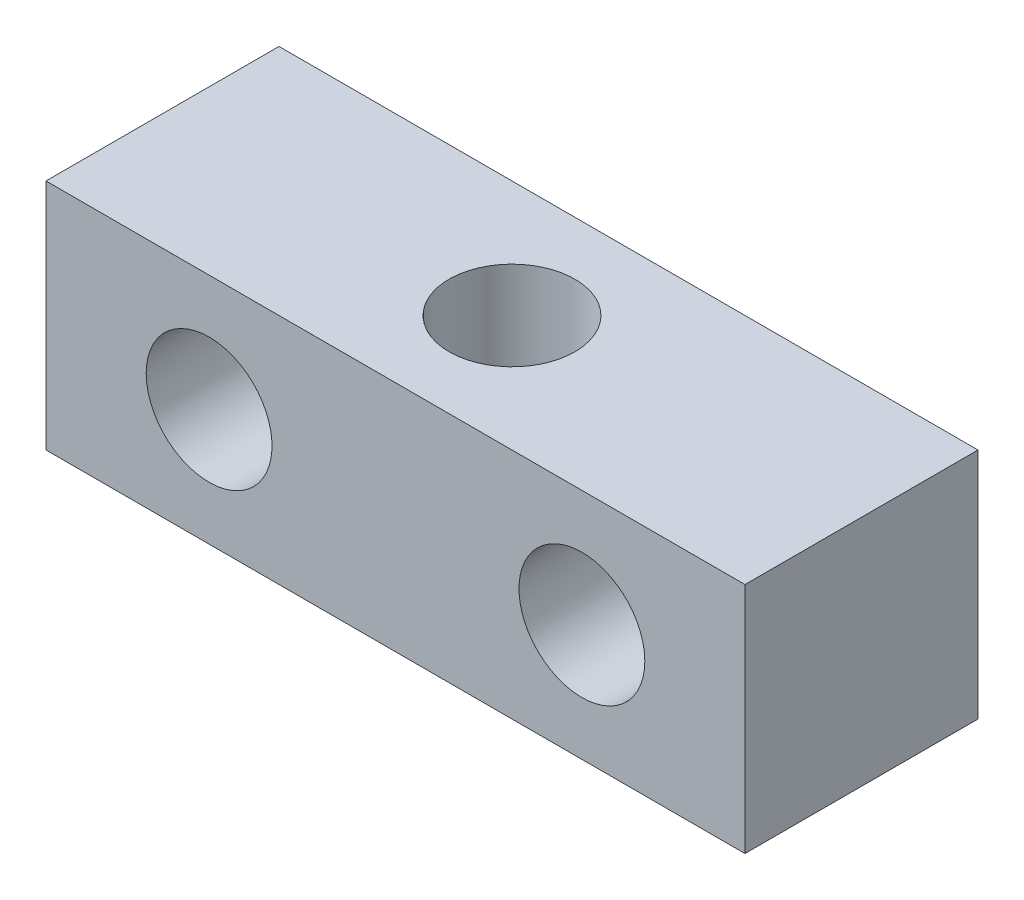
ISO-10303-21;
HEADER;
FILE_DESCRIPTION(('STEP AP214'),'2;1');
FILE_NAME('part.step','',(''),(''),'','','');
FILE_SCHEMA(('AUTOMOTIVE_DESIGN { 1 0 10303 214 1 1 1 1 }'));
ENDSEC;
DATA;
#1=APPLICATION_CONTEXT('core data for automotive mechanical design processes');
#2=APPLICATION_PROTOCOL_DEFINITION('international standard','automotive_design',2000,#1);
#3=PRODUCT_CONTEXT('',#1,'mechanical');
#4=PRODUCT('Part','Part','',(#3));
#5=PRODUCT_RELATED_PRODUCT_CATEGORY('part','',(#4));
#6=PRODUCT_DEFINITION_FORMATION('','',#4);
#7=PRODUCT_DEFINITION_CONTEXT('part definition',#1,'design');
#8=PRODUCT_DEFINITION('design','',#6,#7);
#9=PRODUCT_DEFINITION_SHAPE('','',#8);
#10=(LENGTH_UNIT() NAMED_UNIT(*) SI_UNIT(.MILLI.,.METRE.));
#11=(NAMED_UNIT(*) PLANE_ANGLE_UNIT() SI_UNIT($,.RADIAN.));
#12=(NAMED_UNIT(*) SI_UNIT($,.STERADIAN.) SOLID_ANGLE_UNIT());
#13=UNCERTAINTY_MEASURE_WITH_UNIT(LENGTH_MEASURE(1.E-05),#10,'distance_accuracy_value','');
#14=(GEOMETRIC_REPRESENTATION_CONTEXT(3) GLOBAL_UNCERTAINTY_ASSIGNED_CONTEXT((#13)) GLOBAL_UNIT_ASSIGNED_CONTEXT((#10,
#11,#12)) REPRESENTATION_CONTEXT('',''));
#15=CARTESIAN_POINT('',(0.,0.,0.));
#16=DIRECTION('',(0.,0.,1.));
#17=DIRECTION('',(1.,0.,0.));
#18=AXIS2_PLACEMENT_3D('',#15,#16,#17);
#19=CARTESIAN_POINT('',(19.05,-6.35,12.7));
#20=DIRECTION('',(-1.,0.,0.));
#21=DIRECTION('',(0.,0.,1.));
#22=AXIS2_PLACEMENT_3D('',#19,#20,#21);
#23=PLANE('',#22);
#24=DIRECTION('',(0.,1.,0.));
#25=VECTOR('',#24,1.);
#26=CARTESIAN_POINT('',(19.05,-6.35,0.));
#27=LINE('',#26,#25);
#28=CARTESIAN_POINT('',(19.05,-6.35,0.));
#29=VERTEX_POINT('',#28);
#30=CARTESIAN_POINT('',(19.05,6.35,0.));
#31=VERTEX_POINT('',#30);
#32=EDGE_CURVE('E113',#29,#31,#27,.T.);
#33=ORIENTED_EDGE('',*,*,#32,.T.);
#34=DIRECTION('',(0.,0.,-1.));
#35=VECTOR('',#34,1.);
#36=CARTESIAN_POINT('',(19.05,6.35,12.7));
#37=LINE('',#36,#35);
#38=CARTESIAN_POINT('',(19.05,6.35,12.7));
#39=VERTEX_POINT('',#38);
#40=EDGE_CURVE('E11',#39,#31,#37,.T.);
#41=ORIENTED_EDGE('',*,*,#40,.F.);
#42=DIRECTION('',(0.,1.,0.));
#43=VECTOR('',#42,1.);
#44=CARTESIAN_POINT('',(19.05,-6.35,12.7));
#45=LINE('',#44,#43);
#46=CARTESIAN_POINT('',(19.05,-6.35,12.7));
#47=VERTEX_POINT('',#46);
#48=EDGE_CURVE('E97',#47,#39,#45,.T.);
#49=ORIENTED_EDGE('',*,*,#48,.F.);
#50=DIRECTION('',(0.,0.,-1.));
#51=VECTOR('',#50,1.);
#52=CARTESIAN_POINT('',(19.05,-6.35,12.7));
#53=LINE('',#52,#51);
#54=EDGE_CURVE('E109',#47,#29,#53,.T.);
#55=ORIENTED_EDGE('',*,*,#54,.T.);
#56=EDGE_LOOP('',(#33,#41,#49,#55));
#57=FACE_BOUND('',#56,.T.);
#58=ADVANCED_FACE('F45',(#57),#23,.F.);
#59=CARTESIAN_POINT('',(-19.05,6.35,12.7));
#60=DIRECTION('',(0.,-1.,0.));
#61=DIRECTION('',(0.,0.,-1.));
#62=AXIS2_PLACEMENT_3D('',#59,#60,#61);
#63=PLANE('',#62);
#64=CARTESIAN_POINT('',(0.,6.35,6.35));
#65=DIRECTION('',(0.,1.,0.));
#66=DIRECTION('',(0.,0.,1.));
#67=AXIS2_PLACEMENT_3D('',#64,#65,#66);
#68=CIRCLE('',#67,3.429);
#69=CARTESIAN_POINT('',(0.,6.35,9.779));
#70=VERTEX_POINT('',#69);
#71=EDGE_CURVE('E142',#70,#70,#68,.T.);
#72=ORIENTED_EDGE('',*,*,#71,.F.);
#73=EDGE_LOOP('',(#72));
#74=FACE_BOUND('',#73,.T.);
#75=DIRECTION('',(-1.,0.,0.));
#76=VECTOR('',#75,1.);
#77=CARTESIAN_POINT('',(-19.05,6.35,0.));
#78=LINE('',#77,#76);
#79=CARTESIAN_POINT('',(-19.05,6.35,0.));
#80=VERTEX_POINT('',#79);
#81=EDGE_CURVE('E102',#31,#80,#78,.T.);
#82=ORIENTED_EDGE('',*,*,#81,.T.);
#83=DIRECTION('',(0.,0.,-1.));
#84=VECTOR('',#83,1.);
#85=CARTESIAN_POINT('',(-19.05,6.35,12.7));
#86=LINE('',#85,#84);
#87=CARTESIAN_POINT('',(-19.05,6.35,12.7));
#88=VERTEX_POINT('',#87);
#89=EDGE_CURVE('E54',#88,#80,#86,.T.);
#90=ORIENTED_EDGE('',*,*,#89,.F.);
#91=DIRECTION('',(-1.,0.,0.));
#92=VECTOR('',#91,1.);
#93=CARTESIAN_POINT('',(-19.05,6.35,12.7));
#94=LINE('',#93,#92);
#95=EDGE_CURVE('E92',#39,#88,#94,.T.);
#96=ORIENTED_EDGE('',*,*,#95,.F.);
#97=ORIENTED_EDGE('',*,*,#40,.T.);
#98=EDGE_LOOP('',(#82,#90,#96,#97));
#99=FACE_BOUND('',#98,.T.);
#100=ADVANCED_FACE('F101',(#74,#99),#63,.F.);
#101=CARTESIAN_POINT('',(-19.05,-6.35,12.7));
#102=DIRECTION('',(1.,0.,0.));
#103=DIRECTION('',(0.,0.,-1.));
#104=AXIS2_PLACEMENT_3D('',#101,#102,#103);
#105=PLANE('',#104);
#106=DIRECTION('',(0.,-1.,0.));
#107=VECTOR('',#106,1.);
#108=CARTESIAN_POINT('',(-19.05,-6.35,0.));
#109=LINE('',#108,#107);
#110=CARTESIAN_POINT('',(-19.05,-6.35,0.));
#111=VERTEX_POINT('',#110);
#112=EDGE_CURVE('E79',#80,#111,#109,.T.);
#113=ORIENTED_EDGE('',*,*,#112,.T.);
#114=DIRECTION('',(0.,0.,-1.));
#115=VECTOR('',#114,1.);
#116=CARTESIAN_POINT('',(-19.05,-6.35,12.7));
#117=LINE('',#116,#115);
#118=CARTESIAN_POINT('',(-19.05,-6.35,12.7));
#119=VERTEX_POINT('',#118);
#120=EDGE_CURVE('E104',#119,#111,#117,.T.);
#121=ORIENTED_EDGE('',*,*,#120,.F.);
#122=DIRECTION('',(0.,-1.,0.));
#123=VECTOR('',#122,1.);
#124=CARTESIAN_POINT('',(-19.05,-6.35,12.7));
#125=LINE('',#124,#123);
#126=EDGE_CURVE('E95',#88,#119,#125,.T.);
#127=ORIENTED_EDGE('',*,*,#126,.F.);
#128=ORIENTED_EDGE('',*,*,#89,.T.);
#129=EDGE_LOOP('',(#113,#121,#127,#128));
#130=FACE_BOUND('',#129,.T.);
#131=ADVANCED_FACE('F105',(#130),#105,.F.);
#132=CARTESIAN_POINT('',(-19.05,-6.35,12.7));
#133=DIRECTION('',(0.,1.,0.));
#134=DIRECTION('',(0.,0.,1.));
#135=AXIS2_PLACEMENT_3D('',#132,#133,#134);
#136=PLANE('',#135);
#137=CARTESIAN_POINT('',(0.,-6.35,6.35));
#138=DIRECTION('',(0.,1.,0.));
#139=DIRECTION('',(0.,0.,1.));
#140=AXIS2_PLACEMENT_3D('',#137,#138,#139);
#141=CIRCLE('',#140,3.429);
#142=CARTESIAN_POINT('',(0.,-6.35,9.779));
#143=VERTEX_POINT('',#142);
#144=EDGE_CURVE('E138',#143,#143,#141,.T.);
#145=ORIENTED_EDGE('',*,*,#144,.T.);
#146=EDGE_LOOP('',(#145));
#147=FACE_BOUND('',#146,.T.);
#148=DIRECTION('',(1.,0.,0.));
#149=VECTOR('',#148,1.);
#150=CARTESIAN_POINT('',(-19.05,-6.35,0.));
#151=LINE('',#150,#149);
#152=EDGE_CURVE('E85',#111,#29,#151,.T.);
#153=ORIENTED_EDGE('',*,*,#152,.T.);
#154=ORIENTED_EDGE('',*,*,#54,.F.);
#155=DIRECTION('',(1.,0.,0.));
#156=VECTOR('',#155,1.);
#157=CARTESIAN_POINT('',(-19.05,-6.35,12.7));
#158=LINE('',#157,#156);
#159=EDGE_CURVE('E62',#119,#47,#158,.T.);
#160=ORIENTED_EDGE('',*,*,#159,.F.);
#161=ORIENTED_EDGE('',*,*,#120,.T.);
#162=EDGE_LOOP('',(#153,#154,#160,#161));
#163=FACE_BOUND('',#162,.T.);
#164=ADVANCED_FACE('F127',(#147,#163),#136,.F.);
#165=CARTESIAN_POINT('',(0.,0.,12.7));
#166=DIRECTION('',(0.,0.,-1.));
#167=DIRECTION('',(-1.,0.,0.));
#168=AXIS2_PLACEMENT_3D('',#165,#166,#167);
#169=PLANE('',#168);
#170=CARTESIAN_POINT('',(-10.16,0.,12.7));
#171=DIRECTION('',(0.,0.,-1.));
#172=DIRECTION('',(-1.,0.,0.));
#173=AXIS2_PLACEMENT_3D('',#170,#171,#172);
#174=CIRCLE('',#173,3.429);
#175=CARTESIAN_POINT('',(-13.589,0.,12.7));
#176=VERTEX_POINT('',#175);
#177=EDGE_CURVE('E150',#176,#176,#174,.T.);
#178=ORIENTED_EDGE('',*,*,#177,.T.);
#179=EDGE_LOOP('',(#178));
#180=FACE_BOUND('',#179,.T.);
#181=CARTESIAN_POINT('',(10.16,0.,12.7));
#182=DIRECTION('',(0.,0.,1.));
#183=DIRECTION('',(1.,0.,0.));
#184=AXIS2_PLACEMENT_3D('',#181,#182,#183);
#185=CIRCLE('',#184,3.429);
#186=CARTESIAN_POINT('',(13.589,0.,12.7));
#187=VERTEX_POINT('',#186);
#188=EDGE_CURVE('E134',#187,#187,#185,.T.);
#189=ORIENTED_EDGE('',*,*,#188,.F.);
#190=EDGE_LOOP('',(#189));
#191=FACE_BOUND('',#190,.T.);
#192=ORIENTED_EDGE('',*,*,#48,.T.);
#193=ORIENTED_EDGE('',*,*,#95,.T.);
#194=ORIENTED_EDGE('',*,*,#126,.T.);
#195=ORIENTED_EDGE('',*,*,#159,.T.);
#196=EDGE_LOOP('',(#192,#193,#194,#195));
#197=FACE_BOUND('',#196,.T.);
#198=ADVANCED_FACE('F93',(#180,#191,#197),#169,.F.);
#199=CARTESIAN_POINT('',(0.,0.,0.));
#200=DIRECTION('',(0.,0.,-1.));
#201=DIRECTION('',(-1.,0.,0.));
#202=AXIS2_PLACEMENT_3D('',#199,#200,#201);
#203=PLANE('',#202);
#204=CARTESIAN_POINT('',(-10.16,0.,0.));
#205=DIRECTION('',(0.,0.,-1.));
#206=DIRECTION('',(-1.,0.,0.));
#207=AXIS2_PLACEMENT_3D('',#204,#205,#206);
#208=CIRCLE('',#207,3.429);
#209=CARTESIAN_POINT('',(-13.589,0.,0.));
#210=VERTEX_POINT('',#209);
#211=EDGE_CURVE('E146',#210,#210,#208,.T.);
#212=ORIENTED_EDGE('',*,*,#211,.F.);
#213=EDGE_LOOP('',(#212));
#214=FACE_BOUND('',#213,.T.);
#215=CARTESIAN_POINT('',(10.16,0.,0.));
#216=DIRECTION('',(0.,0.,1.));
#217=DIRECTION('',(1.,0.,0.));
#218=AXIS2_PLACEMENT_3D('',#215,#216,#217);
#219=CIRCLE('',#218,3.429);
#220=CARTESIAN_POINT('',(13.589,0.,0.));
#221=VERTEX_POINT('',#220);
#222=EDGE_CURVE('E117',#221,#221,#219,.T.);
#223=ORIENTED_EDGE('',*,*,#222,.T.);
#224=EDGE_LOOP('',(#223));
#225=FACE_BOUND('',#224,.T.);
#226=ORIENTED_EDGE('',*,*,#32,.F.);
#227=ORIENTED_EDGE('',*,*,#152,.F.);
#228=ORIENTED_EDGE('',*,*,#112,.F.);
#229=ORIENTED_EDGE('',*,*,#81,.F.);
#230=EDGE_LOOP('',(#226,#227,#228,#229));
#231=FACE_BOUND('',#230,.T.);
#232=ADVANCED_FACE('F130',(#214,#225,#231),#203,.T.);
#233=CARTESIAN_POINT('',(10.16,0.,0.));
#234=DIRECTION('',(0.,0.,1.));
#235=DIRECTION('',(1.,0.,0.));
#236=AXIS2_PLACEMENT_3D('',#233,#234,#235);
#237=CYLINDRICAL_SURFACE('',#236,3.429);
#238=ORIENTED_EDGE('',*,*,#222,.F.);
#239=EDGE_LOOP('',(#238));
#240=FACE_BOUND('',#239,.T.);
#241=ORIENTED_EDGE('',*,*,#188,.T.);
#242=EDGE_LOOP('',(#241));
#243=FACE_BOUND('',#242,.T.);
#244=ADVANCED_FACE('F163',(#240,#243),#237,.F.);
#245=CARTESIAN_POINT('',(0.,-6.35,6.35));
#246=DIRECTION('',(0.,1.,0.));
#247=DIRECTION('',(0.,0.,1.));
#248=AXIS2_PLACEMENT_3D('',#245,#246,#247);
#249=CYLINDRICAL_SURFACE('',#248,3.429);
#250=ORIENTED_EDGE('',*,*,#144,.F.);
#251=EDGE_LOOP('',(#250));
#252=FACE_BOUND('',#251,.T.);
#253=ORIENTED_EDGE('',*,*,#71,.T.);
#254=EDGE_LOOP('',(#253));
#255=FACE_BOUND('',#254,.T.);
#256=ADVANCED_FACE('F169',(#252,#255),#249,.F.);
#257=CARTESIAN_POINT('',(-10.16,0.,0.));
#258=DIRECTION('',(0.,0.,1.));
#259=DIRECTION('',(1.,0.,0.));
#260=AXIS2_PLACEMENT_3D('',#257,#258,#259);
#261=CYLINDRICAL_SURFACE('',#260,3.429);
#262=ORIENTED_EDGE('',*,*,#211,.T.);
#263=EDGE_LOOP('',(#262));
#264=FACE_BOUND('',#263,.T.);
#265=ORIENTED_EDGE('',*,*,#177,.F.);
#266=EDGE_LOOP('',(#265));
#267=FACE_BOUND('',#266,.T.);
#268=ADVANCED_FACE('F158',(#264,#267),#261,.F.);
#269=CLOSED_SHELL('',(#58,#100,#131,#164,#198,#232,#244,#256,#268));
#270=MANIFOLD_SOLID_BREP('B2',#269);
#271=ADVANCED_BREP_SHAPE_REPRESENTATION('',(#18,#270),#14);
#272=SHAPE_DEFINITION_REPRESENTATION(#9,#271);
ENDSEC;
END-ISO-10303-21;
